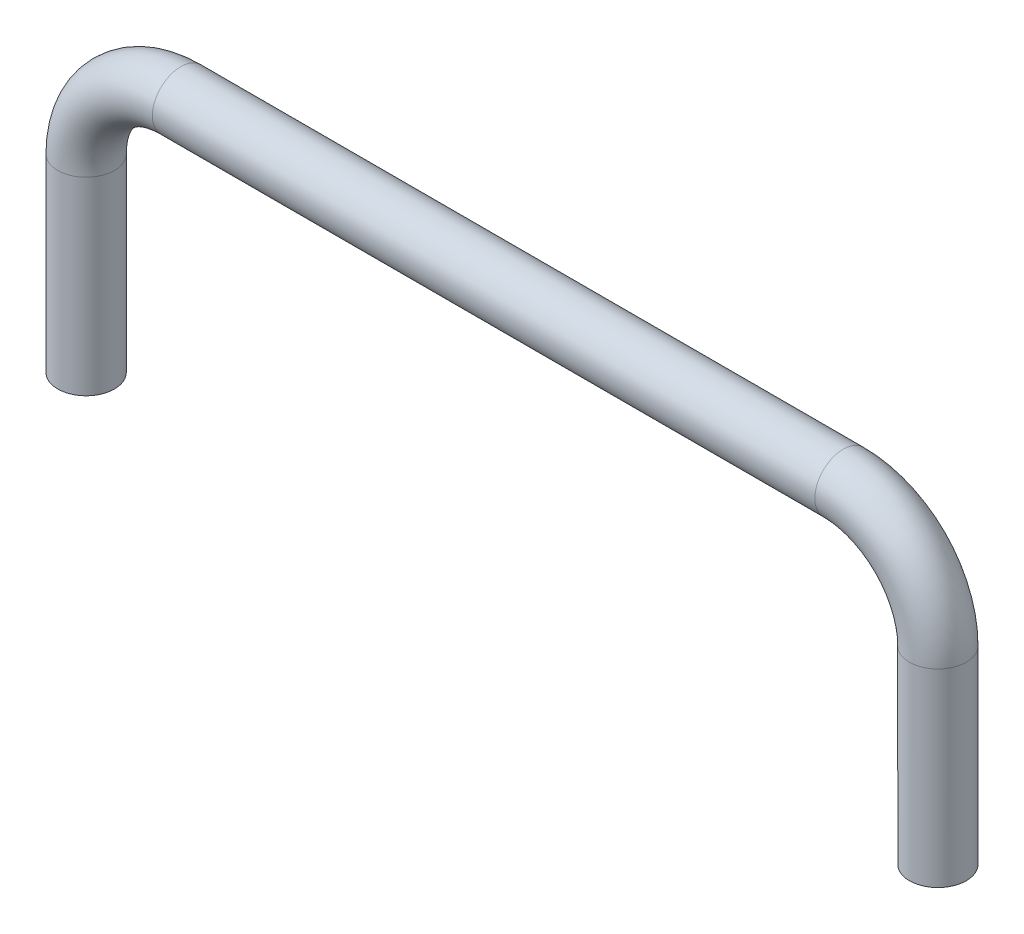
ISO-10303-21;
HEADER;
FILE_DESCRIPTION(('STEP AP214'),'2;1');
FILE_NAME('part.step','',(''),(''),'','','');
FILE_SCHEMA(('AUTOMOTIVE_DESIGN { 1 0 10303 214 1 1 1 1 }'));
ENDSEC;
DATA;
#1=APPLICATION_CONTEXT('core data for automotive mechanical design processes');
#2=APPLICATION_PROTOCOL_DEFINITION('international standard','automotive_design',2000,#1);
#3=PRODUCT_CONTEXT('',#1,'mechanical');
#4=PRODUCT('Part','Part','',(#3));
#5=PRODUCT_RELATED_PRODUCT_CATEGORY('part','',(#4));
#6=PRODUCT_DEFINITION_FORMATION('','',#4);
#7=PRODUCT_DEFINITION_CONTEXT('part definition',#1,'design');
#8=PRODUCT_DEFINITION('design','',#6,#7);
#9=PRODUCT_DEFINITION_SHAPE('','',#8);
#10=(LENGTH_UNIT() NAMED_UNIT(*) SI_UNIT(.MILLI.,.METRE.));
#11=(NAMED_UNIT(*) PLANE_ANGLE_UNIT() SI_UNIT($,.RADIAN.));
#12=(NAMED_UNIT(*) SI_UNIT($,.STERADIAN.) SOLID_ANGLE_UNIT());
#13=UNCERTAINTY_MEASURE_WITH_UNIT(LENGTH_MEASURE(1.E-05),#10,'distance_accuracy_value','');
#14=(GEOMETRIC_REPRESENTATION_CONTEXT(3) GLOBAL_UNCERTAINTY_ASSIGNED_CONTEXT((#13)) GLOBAL_UNIT_ASSIGNED_CONTEXT((#10,
#11,#12)) REPRESENTATION_CONTEXT('',''));
#15=CARTESIAN_POINT('',(0.,0.,0.));
#16=DIRECTION('',(0.,0.,1.));
#17=DIRECTION('',(1.,0.,0.));
#18=AXIS2_PLACEMENT_3D('',#15,#16,#17);
#19=CARTESIAN_POINT('',(0.,0.,0.));
#20=DIRECTION('',(0.,1.,0.));
#21=DIRECTION('',(0.,0.,1.));
#22=AXIS2_PLACEMENT_3D('',#19,#20,#21);
#23=PLANE('',#22);
#24=CARTESIAN_POINT('',(0.,0.,0.));
#25=DIRECTION('',(0.,-1.,0.));
#26=DIRECTION('',(0.,0.,-1.));
#27=AXIS2_PLACEMENT_3D('',#24,#25,#26);
#28=CIRCLE('',#27,1.6);
#29=CARTESIAN_POINT('',(0.,0.,-1.6));
#30=VERTEX_POINT('',#29);
#31=EDGE_CURVE('E77',#30,#30,#28,.T.);
#32=ORIENTED_EDGE('',*,*,#31,.F.);
#33=EDGE_LOOP('',(#32));
#34=FACE_BOUND('',#33,.T.);
#35=CARTESIAN_POINT('',(0.,0.,0.));
#36=DIRECTION('',(0.,1.,0.));
#37=DIRECTION('',(0.,0.,1.));
#38=AXIS2_PLACEMENT_3D('',#35,#36,#37);
#39=CIRCLE('',#38,3.);
#40=CARTESIAN_POINT('',(0.,0.,3.));
#41=VERTEX_POINT('',#40);
#42=EDGE_CURVE('E64',#41,#41,#39,.T.);
#43=ORIENTED_EDGE('',*,*,#42,.F.);
#44=EDGE_LOOP('',(#43));
#45=FACE_BOUND('',#44,.T.);
#46=ADVANCED_FACE('F37',(#34,#45),#23,.F.);
#47=CARTESIAN_POINT('',(90.,0.,0.));
#48=DIRECTION('',(0.,-1.,0.));
#49=DIRECTION('',(0.,0.,1.));
#50=AXIS2_PLACEMENT_3D('',#47,#48,#49);
#51=PLANE('',#50);
#52=CARTESIAN_POINT('',(90.,0.,0.));
#53=DIRECTION('',(0.,-1.,0.));
#54=DIRECTION('',(0.,0.,-1.));
#55=AXIS2_PLACEMENT_3D('',#52,#53,#54);
#56=CIRCLE('',#55,1.60000000000001);
#57=CARTESIAN_POINT('',(90.,0.,-1.60000000000001));
#58=VERTEX_POINT('',#57);
#59=EDGE_CURVE('E69',#58,#58,#56,.T.);
#60=ORIENTED_EDGE('',*,*,#59,.F.);
#61=EDGE_LOOP('',(#60));
#62=FACE_BOUND('',#61,.T.);
#63=CARTESIAN_POINT('',(90.,0.,0.));
#64=DIRECTION('',(0.,-1.,0.));
#65=DIRECTION('',(0.,0.,1.));
#66=AXIS2_PLACEMENT_3D('',#63,#64,#65);
#67=CIRCLE('',#66,3.);
#68=CARTESIAN_POINT('',(90.,0.,3.));
#69=VERTEX_POINT('',#68);
#70=EDGE_CURVE('E10',#69,#69,#67,.T.);
#71=ORIENTED_EDGE('',*,*,#70,.T.);
#72=EDGE_LOOP('',(#71));
#73=FACE_BOUND('',#72,.T.);
#74=ADVANCED_FACE('F96',(#62,#73),#51,.T.);
#75=CARTESIAN_POINT('',(0.,0.,0.));
#76=DIRECTION('',(0.,1.,0.));
#77=DIRECTION('',(0.,0.,1.));
#78=AXIS2_PLACEMENT_3D('',#75,#76,#77);
#79=CYLINDRICAL_SURFACE('',#78,3.);
#80=CARTESIAN_POINT('',(0.,19.9999999999999,0.));
#81=DIRECTION('',(0.,1.,0.));
#82=DIRECTION('',(0.,0.,1.));
#83=AXIS2_PLACEMENT_3D('',#80,#81,#82);
#84=CIRCLE('',#83,3.);
#85=CARTESIAN_POINT('',(-3.,19.9999999999999,0.));
#86=VERTEX_POINT('',#85);
#87=EDGE_CURVE('E60',#86,#86,#84,.T.);
#88=ORIENTED_EDGE('',*,*,#87,.F.);
#89=EDGE_LOOP('',(#88));
#90=FACE_BOUND('',#89,.T.);
#91=ORIENTED_EDGE('',*,*,#42,.T.);
#92=EDGE_LOOP('',(#91));
#93=FACE_BOUND('',#92,.T.);
#94=ADVANCED_FACE('F100',(#90,#93),#79,.T.);
#95=CARTESIAN_POINT('',(10.,20.,0.));
#96=DIRECTION('',(0.,0.,-1.));
#97=DIRECTION('',(-1.,0.,0.));
#98=AXIS2_PLACEMENT_3D('',#95,#96,#97);
#99=TOROIDAL_SURFACE('',#98,10.,3.);
#100=CARTESIAN_POINT('',(10.0000000000001,30.,0.));
#101=DIRECTION('',(1.,0.,0.));
#102=DIRECTION('',(0.,0.,1.));
#103=AXIS2_PLACEMENT_3D('',#100,#101,#102);
#104=CIRCLE('',#103,3.);
#105=CARTESIAN_POINT('',(10.0000000000001,33.,0.));
#106=VERTEX_POINT('',#105);
#107=EDGE_CURVE('E54',#106,#106,#104,.T.);
#108=CARTESIAN_POINT('',(10.,20.,0.));
#109=DIRECTION('',(0.,0.,-1.));
#110=DIRECTION('',(-1.,0.,0.));
#111=AXIS2_PLACEMENT_3D('',#108,#109,#110);
#112=CIRCLE('',#111,13.);
#113=EDGE_CURVE('',#86,#106,#112,.T.);
#114=ORIENTED_EDGE('',*,*,#87,.T.);
#115=ORIENTED_EDGE('',*,*,#107,.F.);
#116=ORIENTED_EDGE('',*,*,#113,.T.);
#117=ORIENTED_EDGE('',*,*,#113,.F.);
#118=EDGE_LOOP('',(#114,#116,#115,#117));
#119=FACE_BOUND('',#118,.T.);
#120=ADVANCED_FACE('F102',(#119),#99,.T.);
#121=CARTESIAN_POINT('',(10.0000000000001,30.,0.));
#122=DIRECTION('',(1.,0.,0.));
#123=DIRECTION('',(0.,0.,-1.));
#124=AXIS2_PLACEMENT_3D('',#121,#122,#123);
#125=CYLINDRICAL_SURFACE('',#124,3.);
#126=CARTESIAN_POINT('',(79.9999999999999,30.,0.));
#127=DIRECTION('',(1.,0.,0.));
#128=DIRECTION('',(0.,0.,1.));
#129=AXIS2_PLACEMENT_3D('',#126,#127,#128);
#130=CIRCLE('',#129,3.);
#131=CARTESIAN_POINT('',(79.9999999999999,33.,0.));
#132=VERTEX_POINT('',#131);
#133=EDGE_CURVE('E49',#132,#132,#130,.T.);
#134=ORIENTED_EDGE('',*,*,#133,.F.);
#135=EDGE_LOOP('',(#134));
#136=FACE_BOUND('',#135,.T.);
#137=ORIENTED_EDGE('',*,*,#107,.T.);
#138=EDGE_LOOP('',(#137));
#139=FACE_BOUND('',#138,.T.);
#140=ADVANCED_FACE('F109',(#136,#139),#125,.T.);
#141=CARTESIAN_POINT('',(80.,20.,0.));
#142=DIRECTION('',(0.,0.,-1.));
#143=DIRECTION('',(-1.,0.,0.));
#144=AXIS2_PLACEMENT_3D('',#141,#142,#143);
#145=TOROIDAL_SURFACE('',#144,10.,3.);
#146=CARTESIAN_POINT('',(90.,20.,0.));
#147=DIRECTION('',(0.,-1.,0.));
#148=DIRECTION('',(0.,0.,1.));
#149=AXIS2_PLACEMENT_3D('',#146,#147,#148);
#150=CIRCLE('',#149,3.);
#151=CARTESIAN_POINT('',(93.,20.,0.));
#152=VERTEX_POINT('',#151);
#153=EDGE_CURVE('E44',#152,#152,#150,.T.);
#154=CARTESIAN_POINT('',(80.,20.,0.));
#155=DIRECTION('',(0.,0.,-1.));
#156=DIRECTION('',(-1.,0.,0.));
#157=AXIS2_PLACEMENT_3D('',#154,#155,#156);
#158=CIRCLE('',#157,13.);
#159=EDGE_CURVE('',#132,#152,#158,.T.);
#160=ORIENTED_EDGE('',*,*,#133,.T.);
#161=ORIENTED_EDGE('',*,*,#153,.F.);
#162=ORIENTED_EDGE('',*,*,#159,.T.);
#163=ORIENTED_EDGE('',*,*,#159,.F.);
#164=EDGE_LOOP('',(#160,#162,#161,#163));
#165=FACE_BOUND('',#164,.T.);
#166=ADVANCED_FACE('F117',(#165),#145,.T.);
#167=CARTESIAN_POINT('',(90.,19.9999999999999,0.));
#168=DIRECTION('',(0.,-1.,0.));
#169=DIRECTION('',(1.,0.,0.));
#170=AXIS2_PLACEMENT_3D('',#167,#168,#169);
#171=CYLINDRICAL_SURFACE('',#170,3.);
#172=ORIENTED_EDGE('',*,*,#70,.F.);
#173=EDGE_LOOP('',(#172));
#174=FACE_BOUND('',#173,.T.);
#175=ORIENTED_EDGE('',*,*,#153,.T.);
#176=EDGE_LOOP('',(#175));
#177=FACE_BOUND('',#176,.T.);
#178=ADVANCED_FACE('F115',(#174,#177),#171,.T.);
#179=CARTESIAN_POINT('',(90.,10.,0.));
#180=DIRECTION('',(0.,-1.,0.));
#181=DIRECTION('',(0.,0.,-1.));
#182=AXIS2_PLACEMENT_3D('',#179,#180,#181);
#183=CYLINDRICAL_SURFACE('',#182,1.60000000000001);
#184=CARTESIAN_POINT('',(90.,10.,0.));
#185=DIRECTION('',(0.,-1.,0.));
#186=DIRECTION('',(0.,0.,-1.));
#187=AXIS2_PLACEMENT_3D('',#184,#185,#186);
#188=CIRCLE('',#187,1.60000000000001);
#189=CARTESIAN_POINT('',(90.,10.,-1.60000000000001));
#190=VERTEX_POINT('',#189);
#191=EDGE_CURVE('E73',#190,#190,#188,.T.);
#192=ORIENTED_EDGE('',*,*,#191,.F.);
#193=EDGE_LOOP('',(#192));
#194=FACE_BOUND('',#193,.T.);
#195=ORIENTED_EDGE('',*,*,#59,.T.);
#196=EDGE_LOOP('',(#195));
#197=FACE_BOUND('',#196,.T.);
#198=ADVANCED_FACE('F97',(#194,#197),#183,.F.);
#199=CARTESIAN_POINT('',(90.,10.,0.));
#200=DIRECTION('',(0.,-1.,0.));
#201=DIRECTION('',(0.,0.,-1.));
#202=AXIS2_PLACEMENT_3D('',#199,#200,#201);
#203=PLANE('',#202);
#204=ORIENTED_EDGE('',*,*,#191,.T.);
#205=EDGE_LOOP('',(#204));
#206=FACE_BOUND('',#205,.T.);
#207=ADVANCED_FACE('F90',(#206),#203,.T.);
#208=CARTESIAN_POINT('',(0.,10.,0.));
#209=DIRECTION('',(0.,-1.,0.));
#210=DIRECTION('',(0.,0.,-1.));
#211=AXIS2_PLACEMENT_3D('',#208,#209,#210);
#212=CYLINDRICAL_SURFACE('',#211,1.6);
#213=CARTESIAN_POINT('',(0.,10.,0.));
#214=DIRECTION('',(0.,-1.,0.));
#215=DIRECTION('',(0.,0.,-1.));
#216=AXIS2_PLACEMENT_3D('',#213,#214,#215);
#217=CIRCLE('',#216,1.6);
#218=CARTESIAN_POINT('',(0.,10.,-1.6));
#219=VERTEX_POINT('',#218);
#220=EDGE_CURVE('E68',#219,#219,#217,.T.);
#221=ORIENTED_EDGE('',*,*,#220,.F.);
#222=EDGE_LOOP('',(#221));
#223=FACE_BOUND('',#222,.T.);
#224=ORIENTED_EDGE('',*,*,#31,.T.);
#225=EDGE_LOOP('',(#224));
#226=FACE_BOUND('',#225,.T.);
#227=ADVANCED_FACE('F87',(#223,#226),#212,.F.);
#228=CARTESIAN_POINT('',(0.,10.,0.));
#229=DIRECTION('',(0.,-1.,0.));
#230=DIRECTION('',(0.,0.,-1.));
#231=AXIS2_PLACEMENT_3D('',#228,#229,#230);
#232=PLANE('',#231);
#233=ORIENTED_EDGE('',*,*,#220,.T.);
#234=EDGE_LOOP('',(#233));
#235=FACE_BOUND('',#234,.T.);
#236=ADVANCED_FACE('F85',(#235),#232,.T.);
#237=CLOSED_SHELL('',(#46,#74,#94,#120,#140,#166,#178,#198,#207,#227,#236));
#238=MANIFOLD_SOLID_BREP('B2',#237);
#239=ADVANCED_BREP_SHAPE_REPRESENTATION('',(#18,#238),#14);
#240=SHAPE_DEFINITION_REPRESENTATION(#9,#239);
ENDSEC;
END-ISO-10303-21;
